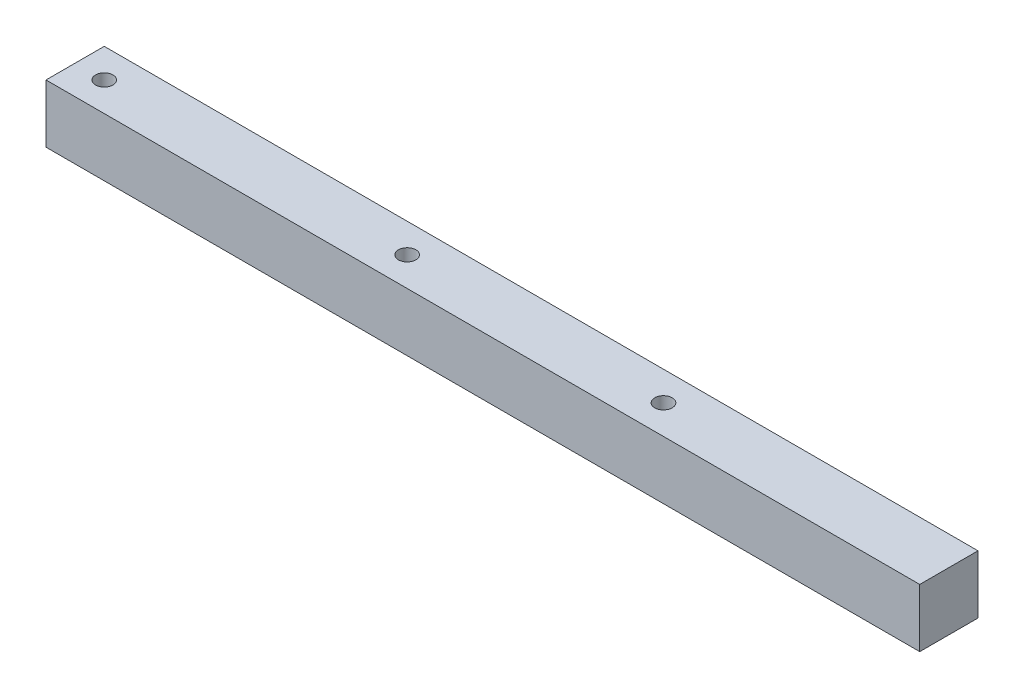
ISO-10303-21;
HEADER;
FILE_DESCRIPTION(('STEP AP214'),'2;1');
FILE_NAME('part.step','',(''),(''),'','','');
FILE_SCHEMA(('AUTOMOTIVE_DESIGN { 1 0 10303 214 1 1 1 1 }'));
ENDSEC;
DATA;
#1=APPLICATION_CONTEXT('core data for automotive mechanical design processes');
#2=APPLICATION_PROTOCOL_DEFINITION('international standard','automotive_design',2000,#1);
#3=PRODUCT_CONTEXT('',#1,'mechanical');
#4=PRODUCT('Part','Part','',(#3));
#5=PRODUCT_RELATED_PRODUCT_CATEGORY('part','',(#4));
#6=PRODUCT_DEFINITION_FORMATION('','',#4);
#7=PRODUCT_DEFINITION_CONTEXT('part definition',#1,'design');
#8=PRODUCT_DEFINITION('design','',#6,#7);
#9=PRODUCT_DEFINITION_SHAPE('','',#8);
#10=(LENGTH_UNIT() NAMED_UNIT(*) SI_UNIT(.MILLI.,.METRE.));
#11=(NAMED_UNIT(*) PLANE_ANGLE_UNIT() SI_UNIT($,.RADIAN.));
#12=(NAMED_UNIT(*) SI_UNIT($,.STERADIAN.) SOLID_ANGLE_UNIT());
#13=UNCERTAINTY_MEASURE_WITH_UNIT(LENGTH_MEASURE(1.E-05),#10,'distance_accuracy_value','');
#14=(GEOMETRIC_REPRESENTATION_CONTEXT(3) GLOBAL_UNCERTAINTY_ASSIGNED_CONTEXT((#13)) GLOBAL_UNIT_ASSIGNED_CONTEXT((#10,
#11,#12)) REPRESENTATION_CONTEXT('',''));
#15=CARTESIAN_POINT('',(0.,0.,0.));
#16=DIRECTION('',(0.,0.,1.));
#17=DIRECTION('',(1.,0.,0.));
#18=AXIS2_PLACEMENT_3D('',#15,#16,#17);
#19=CARTESIAN_POINT('',(300.,-10.,-10.));
#20=DIRECTION('',(0.,0.,1.));
#21=DIRECTION('',(1.,0.,0.));
#22=AXIS2_PLACEMENT_3D('',#19,#20,#21);
#23=PLANE('',#22);
#24=DIRECTION('',(0.,1.,0.));
#25=VECTOR('',#24,1.);
#26=CARTESIAN_POINT('',(0.,-10.,-10.));
#27=LINE('',#26,#25);
#28=CARTESIAN_POINT('',(0.,-10.,-10.));
#29=VERTEX_POINT('',#28);
#30=CARTESIAN_POINT('',(0.,10.,-10.));
#31=VERTEX_POINT('',#30);
#32=EDGE_CURVE('E108',#29,#31,#27,.T.);
#33=ORIENTED_EDGE('',*,*,#32,.T.);
#34=DIRECTION('',(-1.,0.,0.));
#35=VECTOR('',#34,1.);
#36=CARTESIAN_POINT('',(300.,10.,-10.));
#37=LINE('',#36,#35);
#38=CARTESIAN_POINT('',(300.,10.,-10.));
#39=VERTEX_POINT('',#38);
#40=EDGE_CURVE('E13',#39,#31,#37,.T.);
#41=ORIENTED_EDGE('',*,*,#40,.F.);
#42=DIRECTION('',(0.,1.,0.));
#43=VECTOR('',#42,1.);
#44=CARTESIAN_POINT('',(300.,-10.,-10.));
#45=LINE('',#44,#43);
#46=CARTESIAN_POINT('',(300.,-10.,-10.));
#47=VERTEX_POINT('',#46);
#48=EDGE_CURVE('E96',#47,#39,#45,.T.);
#49=ORIENTED_EDGE('',*,*,#48,.F.);
#50=DIRECTION('',(-1.,0.,0.));
#51=VECTOR('',#50,1.);
#52=CARTESIAN_POINT('',(300.,-10.,-10.));
#53=LINE('',#52,#51);
#54=EDGE_CURVE('E104',#47,#29,#53,.T.);
#55=ORIENTED_EDGE('',*,*,#54,.T.);
#56=EDGE_LOOP('',(#33,#41,#49,#55));
#57=FACE_BOUND('',#56,.T.);
#58=ADVANCED_FACE('F45',(#57),#23,.F.);
#59=CARTESIAN_POINT('',(300.,10.,10.));
#60=DIRECTION('',(0.,-1.,0.));
#61=DIRECTION('',(0.,0.,-1.));
#62=AXIS2_PLACEMENT_3D('',#59,#60,#61);
#63=PLANE('',#62);
#64=CARTESIAN_POINT('',(10.,10.,0.));
#65=DIRECTION('',(0.,1.,0.));
#66=DIRECTION('',(0.,0.,1.));
#67=AXIS2_PLACEMENT_3D('',#64,#65,#66);
#68=CIRCLE('',#67,3.00000000000001);
#69=CARTESIAN_POINT('',(10.,10.,3.00000000000001));
#70=VERTEX_POINT('',#69);
#71=EDGE_CURVE('E134',#70,#70,#68,.T.);
#72=ORIENTED_EDGE('',*,*,#71,.F.);
#73=EDGE_LOOP('',(#72));
#74=FACE_BOUND('',#73,.T.);
#75=CARTESIAN_POINT('',(114.,10.,0.));
#76=DIRECTION('',(0.,1.,0.));
#77=DIRECTION('',(0.,0.,1.));
#78=AXIS2_PLACEMENT_3D('',#75,#76,#77);
#79=CIRCLE('',#78,3.00000000000001);
#80=CARTESIAN_POINT('',(114.,10.,3.00000000000001));
#81=VERTEX_POINT('',#80);
#82=EDGE_CURVE('E128',#81,#81,#79,.T.);
#83=ORIENTED_EDGE('',*,*,#82,.F.);
#84=EDGE_LOOP('',(#83));
#85=FACE_BOUND('',#84,.T.);
#86=CARTESIAN_POINT('',(202.,10.,0.));
#87=DIRECTION('',(0.,1.,0.));
#88=DIRECTION('',(0.,0.,1.));
#89=AXIS2_PLACEMENT_3D('',#86,#87,#88);
#90=CIRCLE('',#89,2.99999999999999);
#91=CARTESIAN_POINT('',(202.,10.,2.99999999999999));
#92=VERTEX_POINT('',#91);
#93=EDGE_CURVE('E122',#92,#92,#90,.T.);
#94=ORIENTED_EDGE('',*,*,#93,.F.);
#95=EDGE_LOOP('',(#94));
#96=FACE_BOUND('',#95,.T.);
#97=DIRECTION('',(0.,0.,1.));
#98=VECTOR('',#97,1.);
#99=CARTESIAN_POINT('',(0.,10.,10.));
#100=LINE('',#99,#98);
#101=CARTESIAN_POINT('',(0.,10.,10.));
#102=VERTEX_POINT('',#101);
#103=EDGE_CURVE('E100',#31,#102,#100,.T.);
#104=ORIENTED_EDGE('',*,*,#103,.T.);
#105=DIRECTION('',(-1.,0.,0.));
#106=VECTOR('',#105,1.);
#107=CARTESIAN_POINT('',(300.,10.,10.));
#108=LINE('',#107,#106);
#109=CARTESIAN_POINT('',(300.,10.,10.));
#110=VERTEX_POINT('',#109);
#111=EDGE_CURVE('E53',#110,#102,#108,.T.);
#112=ORIENTED_EDGE('',*,*,#111,.F.);
#113=DIRECTION('',(0.,0.,1.));
#114=VECTOR('',#113,1.);
#115=CARTESIAN_POINT('',(300.,10.,10.));
#116=LINE('',#115,#114);
#117=EDGE_CURVE('E91',#39,#110,#116,.T.);
#118=ORIENTED_EDGE('',*,*,#117,.F.);
#119=ORIENTED_EDGE('',*,*,#40,.T.);
#120=EDGE_LOOP('',(#104,#112,#118,#119));
#121=FACE_BOUND('',#120,.T.);
#122=ADVANCED_FACE('F99',(#74,#85,#96,#121),#63,.F.);
#123=CARTESIAN_POINT('',(300.,-10.,10.));
#124=DIRECTION('',(0.,0.,-1.));
#125=DIRECTION('',(-1.,0.,0.));
#126=AXIS2_PLACEMENT_3D('',#123,#124,#125);
#127=PLANE('',#126);
#128=DIRECTION('',(0.,-1.,0.));
#129=VECTOR('',#128,1.);
#130=CARTESIAN_POINT('',(0.,-10.,10.));
#131=LINE('',#130,#129);
#132=CARTESIAN_POINT('',(0.,-10.,10.));
#133=VERTEX_POINT('',#132);
#134=EDGE_CURVE('E78',#102,#133,#131,.T.);
#135=ORIENTED_EDGE('',*,*,#134,.T.);
#136=DIRECTION('',(-1.,0.,0.));
#137=VECTOR('',#136,1.);
#138=CARTESIAN_POINT('',(300.,-10.,10.));
#139=LINE('',#138,#137);
#140=CARTESIAN_POINT('',(300.,-10.,10.));
#141=VERTEX_POINT('',#140);
#142=EDGE_CURVE('E101',#141,#133,#139,.T.);
#143=ORIENTED_EDGE('',*,*,#142,.F.);
#144=DIRECTION('',(0.,-1.,0.));
#145=VECTOR('',#144,1.);
#146=CARTESIAN_POINT('',(300.,-10.,10.));
#147=LINE('',#146,#145);
#148=EDGE_CURVE('E94',#110,#141,#147,.T.);
#149=ORIENTED_EDGE('',*,*,#148,.F.);
#150=ORIENTED_EDGE('',*,*,#111,.T.);
#151=EDGE_LOOP('',(#135,#143,#149,#150));
#152=FACE_BOUND('',#151,.T.);
#153=ADVANCED_FACE('F102',(#152),#127,.F.);
#154=CARTESIAN_POINT('',(300.,-10.,10.));
#155=DIRECTION('',(0.,1.,0.));
#156=DIRECTION('',(0.,0.,1.));
#157=AXIS2_PLACEMENT_3D('',#154,#155,#156);
#158=PLANE('',#157);
#159=CARTESIAN_POINT('',(10.,-10.,0.));
#160=DIRECTION('',(0.,1.,0.));
#161=DIRECTION('',(0.,0.,1.));
#162=AXIS2_PLACEMENT_3D('',#159,#160,#161);
#163=CIRCLE('',#162,3.00000000000001);
#164=CARTESIAN_POINT('',(10.,-10.,3.00000000000001));
#165=VERTEX_POINT('',#164);
#166=EDGE_CURVE('E111',#165,#165,#163,.T.);
#167=ORIENTED_EDGE('',*,*,#166,.T.);
#168=EDGE_LOOP('',(#167));
#169=FACE_BOUND('',#168,.T.);
#170=CARTESIAN_POINT('',(114.,-10.,0.));
#171=DIRECTION('',(0.,1.,0.));
#172=DIRECTION('',(0.,0.,1.));
#173=AXIS2_PLACEMENT_3D('',#170,#171,#172);
#174=CIRCLE('',#173,3.00000000000001);
#175=CARTESIAN_POINT('',(114.,-10.,3.00000000000001));
#176=VERTEX_POINT('',#175);
#177=EDGE_CURVE('E131',#176,#176,#174,.T.);
#178=ORIENTED_EDGE('',*,*,#177,.T.);
#179=EDGE_LOOP('',(#178));
#180=FACE_BOUND('',#179,.T.);
#181=CARTESIAN_POINT('',(202.,-10.,0.));
#182=DIRECTION('',(0.,1.,0.));
#183=DIRECTION('',(0.,0.,1.));
#184=AXIS2_PLACEMENT_3D('',#181,#182,#183);
#185=CIRCLE('',#184,2.99999999999999);
#186=CARTESIAN_POINT('',(202.,-10.,2.99999999999999));
#187=VERTEX_POINT('',#186);
#188=EDGE_CURVE('E125',#187,#187,#185,.T.);
#189=ORIENTED_EDGE('',*,*,#188,.T.);
#190=EDGE_LOOP('',(#189));
#191=FACE_BOUND('',#190,.T.);
#192=DIRECTION('',(0.,0.,-1.));
#193=VECTOR('',#192,1.);
#194=CARTESIAN_POINT('',(0.,-10.,10.));
#195=LINE('',#194,#193);
#196=EDGE_CURVE('E84',#133,#29,#195,.T.);
#197=ORIENTED_EDGE('',*,*,#196,.T.);
#198=ORIENTED_EDGE('',*,*,#54,.F.);
#199=DIRECTION('',(0.,0.,-1.));
#200=VECTOR('',#199,1.);
#201=CARTESIAN_POINT('',(300.,-10.,10.));
#202=LINE('',#201,#200);
#203=EDGE_CURVE('E61',#141,#47,#202,.T.);
#204=ORIENTED_EDGE('',*,*,#203,.F.);
#205=ORIENTED_EDGE('',*,*,#142,.T.);
#206=EDGE_LOOP('',(#197,#198,#204,#205));
#207=FACE_BOUND('',#206,.T.);
#208=ADVANCED_FACE('F116',(#169,#180,#191,#207),#158,.F.);
#209=CARTESIAN_POINT('',(300.,0.,0.));
#210=DIRECTION('',(-1.,0.,0.));
#211=DIRECTION('',(0.,0.,1.));
#212=AXIS2_PLACEMENT_3D('',#209,#210,#211);
#213=PLANE('',#212);
#214=ORIENTED_EDGE('',*,*,#48,.T.);
#215=ORIENTED_EDGE('',*,*,#117,.T.);
#216=ORIENTED_EDGE('',*,*,#148,.T.);
#217=ORIENTED_EDGE('',*,*,#203,.T.);
#218=EDGE_LOOP('',(#214,#215,#216,#217));
#219=FACE_BOUND('',#218,.T.);
#220=ADVANCED_FACE('F92',(#219),#213,.F.);
#221=CARTESIAN_POINT('',(0.,0.,0.));
#222=DIRECTION('',(-1.,0.,0.));
#223=DIRECTION('',(0.,0.,1.));
#224=AXIS2_PLACEMENT_3D('',#221,#222,#223);
#225=PLANE('',#224);
#226=ORIENTED_EDGE('',*,*,#32,.F.);
#227=ORIENTED_EDGE('',*,*,#196,.F.);
#228=ORIENTED_EDGE('',*,*,#134,.F.);
#229=ORIENTED_EDGE('',*,*,#103,.F.);
#230=EDGE_LOOP('',(#226,#227,#228,#229));
#231=FACE_BOUND('',#230,.T.);
#232=ADVANCED_FACE('F119',(#231),#225,.T.);
#233=CARTESIAN_POINT('',(202.,-10.,0.));
#234=DIRECTION('',(0.,1.,0.));
#235=DIRECTION('',(0.,0.,1.));
#236=AXIS2_PLACEMENT_3D('',#233,#234,#235);
#237=CYLINDRICAL_SURFACE('',#236,2.99999999999999);
#238=ORIENTED_EDGE('',*,*,#188,.F.);
#239=EDGE_LOOP('',(#238));
#240=FACE_BOUND('',#239,.T.);
#241=ORIENTED_EDGE('',*,*,#93,.T.);
#242=EDGE_LOOP('',(#241));
#243=FACE_BOUND('',#242,.T.);
#244=ADVANCED_FACE('F155',(#240,#243),#237,.F.);
#245=CARTESIAN_POINT('',(114.,-10.,0.));
#246=DIRECTION('',(0.,1.,0.));
#247=DIRECTION('',(0.,0.,1.));
#248=AXIS2_PLACEMENT_3D('',#245,#246,#247);
#249=CYLINDRICAL_SURFACE('',#248,3.00000000000001);
#250=ORIENTED_EDGE('',*,*,#177,.F.);
#251=EDGE_LOOP('',(#250));
#252=FACE_BOUND('',#251,.T.);
#253=ORIENTED_EDGE('',*,*,#82,.T.);
#254=EDGE_LOOP('',(#253));
#255=FACE_BOUND('',#254,.T.);
#256=ADVANCED_FACE('F145',(#252,#255),#249,.F.);
#257=CARTESIAN_POINT('',(10.,-10.,0.));
#258=DIRECTION('',(0.,1.,0.));
#259=DIRECTION('',(0.,0.,1.));
#260=AXIS2_PLACEMENT_3D('',#257,#258,#259);
#261=CYLINDRICAL_SURFACE('',#260,3.00000000000001);
#262=ORIENTED_EDGE('',*,*,#166,.F.);
#263=EDGE_LOOP('',(#262));
#264=FACE_BOUND('',#263,.T.);
#265=ORIENTED_EDGE('',*,*,#71,.T.);
#266=EDGE_LOOP('',(#265));
#267=FACE_BOUND('',#266,.T.);
#268=ADVANCED_FACE('F142',(#264,#267),#261,.F.);
#269=CLOSED_SHELL('',(#58,#122,#153,#208,#220,#232,#244,#256,#268));
#270=MANIFOLD_SOLID_BREP('B2',#269);
#271=ADVANCED_BREP_SHAPE_REPRESENTATION('',(#18,#270),#14);
#272=SHAPE_DEFINITION_REPRESENTATION(#9,#271);
ENDSEC;
END-ISO-10303-21;
